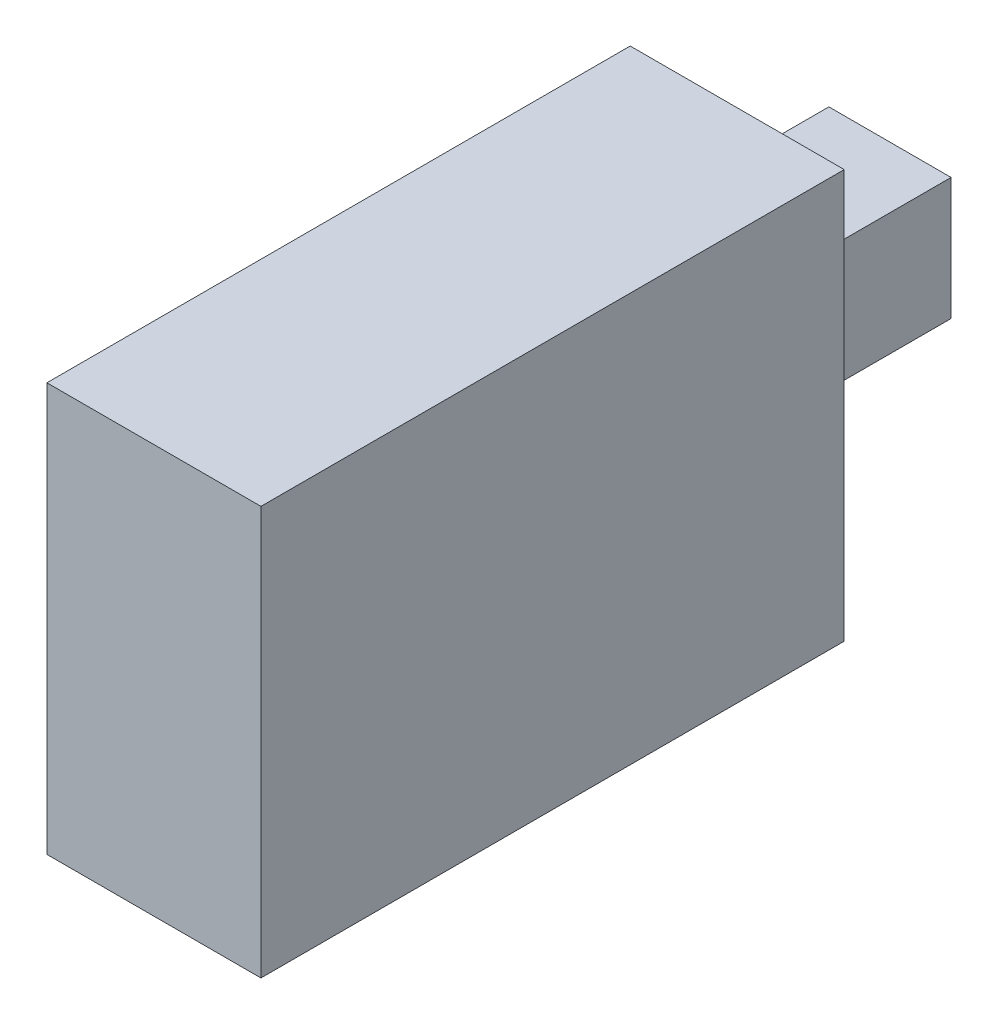
ISO-10303-21;
HEADER;
FILE_DESCRIPTION(('STEP AP214'),'2;1');
FILE_NAME('part.step','',(''),(''),'','','');
FILE_SCHEMA(('AUTOMOTIVE_DESIGN { 1 0 10303 214 1 1 1 1 }'));
ENDSEC;
DATA;
#1=APPLICATION_CONTEXT('core data for automotive mechanical design processes');
#2=APPLICATION_PROTOCOL_DEFINITION('international standard','automotive_design',2000,#1);
#3=PRODUCT_CONTEXT('',#1,'mechanical');
#4=PRODUCT('Part','Part','',(#3));
#5=PRODUCT_RELATED_PRODUCT_CATEGORY('part','',(#4));
#6=PRODUCT_DEFINITION_FORMATION('','',#4);
#7=PRODUCT_DEFINITION_CONTEXT('part definition',#1,'design');
#8=PRODUCT_DEFINITION('design','',#6,#7);
#9=PRODUCT_DEFINITION_SHAPE('','',#8);
#10=(LENGTH_UNIT() NAMED_UNIT(*) SI_UNIT(.MILLI.,.METRE.));
#11=(NAMED_UNIT(*) PLANE_ANGLE_UNIT() SI_UNIT($,.RADIAN.));
#12=(NAMED_UNIT(*) SI_UNIT($,.STERADIAN.) SOLID_ANGLE_UNIT());
#13=UNCERTAINTY_MEASURE_WITH_UNIT(LENGTH_MEASURE(1.E-05),#10,'distance_accuracy_value','');
#14=(GEOMETRIC_REPRESENTATION_CONTEXT(3) GLOBAL_UNCERTAINTY_ASSIGNED_CONTEXT((#13)) GLOBAL_UNIT_ASSIGNED_CONTEXT((#10,
#11,#12)) REPRESENTATION_CONTEXT('',''));
#15=CARTESIAN_POINT('',(0.,0.,0.));
#16=DIRECTION('',(0.,0.,1.));
#17=DIRECTION('',(1.,0.,0.));
#18=AXIS2_PLACEMENT_3D('',#15,#16,#17);
#19=CARTESIAN_POINT('',(-29.3274,0.,-45.77));
#20=DIRECTION('',(0.,0.,-1.));
#21=DIRECTION('',(-1.,0.,0.));
#22=AXIS2_PLACEMENT_3D('',#19,#20,#21);
#23=PLANE('',#22);
#24=DIRECTION('',(1.,0.,0.));
#25=VECTOR('',#24,1.);
#26=CARTESIAN_POINT('',(-24.1,5.6,-45.77));
#27=LINE('',#26,#25);
#28=CARTESIAN_POINT('',(-27.9,5.6,-45.77));
#29=VERTEX_POINT('',#28);
#30=CARTESIAN_POINT('',(-24.1,5.6,-45.77));
#31=VERTEX_POINT('',#30);
#32=EDGE_CURVE('E20',#29,#31,#27,.T.);
#33=ORIENTED_EDGE('',*,*,#32,.F.);
#34=DIRECTION('',(0.,1.,0.));
#35=VECTOR('',#34,1.);
#36=CARTESIAN_POINT('',(-27.9,5.6,-45.77));
#37=LINE('',#36,#35);
#38=CARTESIAN_POINT('',(-27.9,9.4,-45.77));
#39=VERTEX_POINT('',#38);
#40=EDGE_CURVE('E107',#39,#29,#37,.F.);
#41=ORIENTED_EDGE('',*,*,#40,.F.);
#42=DIRECTION('',(1.,0.,0.));
#43=VECTOR('',#42,1.);
#44=CARTESIAN_POINT('',(-27.9,9.4,-45.77));
#45=LINE('',#44,#43);
#46=CARTESIAN_POINT('',(-24.1,9.4,-45.77));
#47=VERTEX_POINT('',#46);
#48=EDGE_CURVE('E92',#47,#39,#45,.F.);
#49=ORIENTED_EDGE('',*,*,#48,.F.);
#50=DIRECTION('',(0.,1.,0.));
#51=VECTOR('',#50,1.);
#52=CARTESIAN_POINT('',(-24.1,9.4,-45.77));
#53=LINE('',#52,#51);
#54=EDGE_CURVE('E79',#31,#47,#53,.T.);
#55=ORIENTED_EDGE('',*,*,#54,.F.);
#56=EDGE_LOOP('',(#33,#41,#49,#55));
#57=FACE_BOUND('',#56,.T.);
#58=ADVANCED_FACE('F17',(#57),#23,.T.);
#59=CARTESIAN_POINT('',(-24.1,5.6,-41.02));
#60=DIRECTION('',(0.,-1.,0.));
#61=DIRECTION('',(0.,0.,-1.));
#62=AXIS2_PLACEMENT_3D('',#59,#60,#61);
#63=PLANE('',#62);
#64=DIRECTION('',(0.,0.,1.));
#65=VECTOR('',#64,1.);
#66=CARTESIAN_POINT('',(-27.9,5.6,-41.02));
#67=LINE('',#66,#65);
#68=CARTESIAN_POINT('',(-27.9,5.6,-41.02));
#69=VERTEX_POINT('',#68);
#70=EDGE_CURVE('E88',#29,#69,#67,.T.);
#71=ORIENTED_EDGE('',*,*,#70,.F.);
#72=ORIENTED_EDGE('',*,*,#32,.T.);
#73=DIRECTION('',(0.,0.,-1.));
#74=VECTOR('',#73,1.);
#75=CARTESIAN_POINT('',(-24.1,5.6,-41.02));
#76=LINE('',#75,#74);
#77=CARTESIAN_POINT('',(-24.1,5.6,-41.02));
#78=VERTEX_POINT('',#77);
#79=EDGE_CURVE('E85',#78,#31,#76,.T.);
#80=ORIENTED_EDGE('',*,*,#79,.F.);
#81=DIRECTION('',(-1.,0.,0.));
#82=VECTOR('',#81,1.);
#83=CARTESIAN_POINT('',(-22.6726,5.6,-41.02));
#84=LINE('',#83,#82);
#85=EDGE_CURVE('E109',#69,#78,#84,.F.);
#86=ORIENTED_EDGE('',*,*,#85,.F.);
#87=EDGE_LOOP('',(#71,#72,#80,#86));
#88=FACE_BOUND('',#87,.T.);
#89=ADVANCED_FACE('F84',(#88),#63,.T.);
#90=CARTESIAN_POINT('',(-24.1,9.4,-41.02));
#91=DIRECTION('',(1.,0.,0.));
#92=DIRECTION('',(0.,0.,-1.));
#93=AXIS2_PLACEMENT_3D('',#90,#91,#92);
#94=PLANE('',#93);
#95=ORIENTED_EDGE('',*,*,#79,.T.);
#96=ORIENTED_EDGE('',*,*,#54,.T.);
#97=DIRECTION('',(0.,0.,1.));
#98=VECTOR('',#97,1.);
#99=CARTESIAN_POINT('',(-24.1,9.4,-41.02));
#100=LINE('',#99,#98);
#101=CARTESIAN_POINT('',(-24.1,9.4,-41.02));
#102=VERTEX_POINT('',#101);
#103=EDGE_CURVE('E94',#102,#47,#100,.F.);
#104=ORIENTED_EDGE('',*,*,#103,.F.);
#105=DIRECTION('',(0.,1.,0.));
#106=VECTOR('',#105,1.);
#107=CARTESIAN_POINT('',(-24.1,0.,-41.02));
#108=LINE('',#107,#106);
#109=EDGE_CURVE('E98',#78,#102,#108,.T.);
#110=ORIENTED_EDGE('',*,*,#109,.F.);
#111=EDGE_LOOP('',(#95,#96,#104,#110));
#112=FACE_BOUND('',#111,.T.);
#113=ADVANCED_FACE('F96',(#112),#94,.T.);
#114=CARTESIAN_POINT('',(-27.9,9.4,-41.02));
#115=DIRECTION('',(0.,1.,0.));
#116=DIRECTION('',(0.,0.,1.));
#117=AXIS2_PLACEMENT_3D('',#114,#115,#116);
#118=PLANE('',#117);
#119=ORIENTED_EDGE('',*,*,#103,.T.);
#120=ORIENTED_EDGE('',*,*,#48,.T.);
#121=DIRECTION('',(0.,0.,1.));
#122=VECTOR('',#121,1.);
#123=CARTESIAN_POINT('',(-27.9,9.4,-41.02));
#124=LINE('',#123,#122);
#125=CARTESIAN_POINT('',(-27.9,9.4,-41.02));
#126=VERTEX_POINT('',#125);
#127=EDGE_CURVE('E104',#126,#39,#124,.F.);
#128=ORIENTED_EDGE('',*,*,#127,.F.);
#129=DIRECTION('',(-1.,0.,0.));
#130=VECTOR('',#129,1.);
#131=CARTESIAN_POINT('',(-22.6726,9.4,-41.02));
#132=LINE('',#131,#130);
#133=EDGE_CURVE('E112',#102,#126,#132,.T.);
#134=ORIENTED_EDGE('',*,*,#133,.F.);
#135=EDGE_LOOP('',(#119,#120,#128,#134));
#136=FACE_BOUND('',#135,.T.);
#137=ADVANCED_FACE('F166',(#136),#118,.T.);
#138=CARTESIAN_POINT('',(-27.9,5.6,-41.02));
#139=DIRECTION('',(-1.,0.,0.));
#140=DIRECTION('',(0.,0.,1.));
#141=AXIS2_PLACEMENT_3D('',#138,#139,#140);
#142=PLANE('',#141);
#143=ORIENTED_EDGE('',*,*,#127,.T.);
#144=ORIENTED_EDGE('',*,*,#40,.T.);
#145=ORIENTED_EDGE('',*,*,#70,.T.);
#146=DIRECTION('',(0.,1.,0.));
#147=VECTOR('',#146,1.);
#148=CARTESIAN_POINT('',(-27.9,0.,-41.02));
#149=LINE('',#148,#147);
#150=EDGE_CURVE('E115',#126,#69,#149,.F.);
#151=ORIENTED_EDGE('',*,*,#150,.F.);
#152=EDGE_LOOP('',(#143,#144,#145,#151));
#153=FACE_BOUND('',#152,.T.);
#154=ADVANCED_FACE('F168',(#153),#142,.T.);
#155=CARTESIAN_POINT('',(-22.6726,0.,-22.884));
#156=DIRECTION('',(1.,0.,0.));
#157=DIRECTION('',(0.,0.,-1.));
#158=AXIS2_PLACEMENT_3D('',#155,#156,#157);
#159=PLANE('',#158);
#160=DIRECTION('',(0.,1.,0.));
#161=VECTOR('',#160,1.);
#162=CARTESIAN_POINT('',(-22.6726,0.,-41.02));
#163=LINE('',#162,#161);
#164=CARTESIAN_POINT('',(-22.6726,12.7,-41.02));
#165=VERTEX_POINT('',#164);
#166=CARTESIAN_POINT('',(-22.6726,0.,-41.02));
#167=VERTEX_POINT('',#166);
#168=EDGE_CURVE('E118',#165,#167,#163,.F.);
#169=ORIENTED_EDGE('',*,*,#168,.F.);
#170=DIRECTION('',(0.,0.,1.));
#171=VECTOR('',#170,1.);
#172=CARTESIAN_POINT('',(-22.6726,12.7,0.));
#173=LINE('',#172,#171);
#174=CARTESIAN_POINT('',(-22.6726,12.7,-22.884));
#175=VERTEX_POINT('',#174);
#176=EDGE_CURVE('E131',#175,#165,#173,.F.);
#177=ORIENTED_EDGE('',*,*,#176,.F.);
#178=DIRECTION('',(0.,1.,0.));
#179=VECTOR('',#178,1.);
#180=CARTESIAN_POINT('',(-22.6726,0.,-22.884));
#181=LINE('',#180,#179);
#182=CARTESIAN_POINT('',(-22.6726,0.,-22.884));
#183=VERTEX_POINT('',#182);
#184=EDGE_CURVE('E128',#183,#175,#181,.T.);
#185=ORIENTED_EDGE('',*,*,#184,.F.);
#186=DIRECTION('',(0.,0.,1.));
#187=VECTOR('',#186,1.);
#188=CARTESIAN_POINT('',(-22.6726,0.,-45.72));
#189=LINE('',#188,#187);
#190=EDGE_CURVE('E121',#183,#167,#189,.F.);
#191=ORIENTED_EDGE('',*,*,#190,.T.);
#192=EDGE_LOOP('',(#169,#177,#185,#191));
#193=FACE_BOUND('',#192,.T.);
#194=ADVANCED_FACE('F154',(#193),#159,.T.);
#195=CARTESIAN_POINT('',(-22.6726,0.,-41.02));
#196=DIRECTION('',(0.,0.,-1.));
#197=DIRECTION('',(-1.,0.,0.));
#198=AXIS2_PLACEMENT_3D('',#195,#196,#197);
#199=PLANE('',#198);
#200=DIRECTION('',(0.,1.,0.));
#201=VECTOR('',#200,1.);
#202=CARTESIAN_POINT('',(-29.3274,0.,-41.02));
#203=LINE('',#202,#201);
#204=CARTESIAN_POINT('',(-29.3274,12.7,-41.02));
#205=VERTEX_POINT('',#204);
#206=CARTESIAN_POINT('',(-29.3274,0.,-41.02));
#207=VERTEX_POINT('',#206);
#208=EDGE_CURVE('E137',#205,#207,#203,.F.);
#209=ORIENTED_EDGE('',*,*,#208,.F.);
#210=DIRECTION('',(1.,0.,0.));
#211=VECTOR('',#210,1.);
#212=CARTESIAN_POINT('',(0.,12.7,-41.02));
#213=LINE('',#212,#211);
#214=EDGE_CURVE('E134',#165,#205,#213,.F.);
#215=ORIENTED_EDGE('',*,*,#214,.F.);
#216=ORIENTED_EDGE('',*,*,#168,.T.);
#217=DIRECTION('',(1.,0.,0.));
#218=VECTOR('',#217,1.);
#219=CARTESIAN_POINT('',(-30.92241196527,0.,-41.02));
#220=LINE('',#219,#218);
#221=EDGE_CURVE('E123',#167,#207,#220,.F.);
#222=ORIENTED_EDGE('',*,*,#221,.T.);
#223=EDGE_LOOP('',(#209,#215,#216,#222));
#224=FACE_BOUND('',#223,.T.);
#225=ORIENTED_EDGE('',*,*,#133,.T.);
#226=ORIENTED_EDGE('',*,*,#150,.T.);
#227=ORIENTED_EDGE('',*,*,#85,.T.);
#228=ORIENTED_EDGE('',*,*,#109,.T.);
#229=EDGE_LOOP('',(#225,#226,#227,#228));
#230=FACE_BOUND('',#229,.T.);
#231=ADVANCED_FACE('F159',(#224,#230),#199,.T.);
#232=CARTESIAN_POINT('',(-30.92241196527,0.,-45.72));
#233=DIRECTION('',(0.,1.,0.));
#234=DIRECTION('',(0.,0.,1.));
#235=AXIS2_PLACEMENT_3D('',#232,#233,#234);
#236=PLANE('',#235);
#237=ORIENTED_EDGE('',*,*,#221,.F.);
#238=ORIENTED_EDGE('',*,*,#190,.F.);
#239=DIRECTION('',(1.,0.,0.));
#240=VECTOR('',#239,1.);
#241=CARTESIAN_POINT('',(-29.3274,0.,-22.884));
#242=LINE('',#241,#240);
#243=CARTESIAN_POINT('',(-29.3274,0.,-22.884));
#244=VERTEX_POINT('',#243);
#245=EDGE_CURVE('E125',#244,#183,#242,.T.);
#246=ORIENTED_EDGE('',*,*,#245,.F.);
#247=DIRECTION('',(0.,0.,1.));
#248=VECTOR('',#247,1.);
#249=CARTESIAN_POINT('',(-29.3274,0.,-41.02));
#250=LINE('',#249,#248);
#251=EDGE_CURVE('E140',#207,#244,#250,.T.);
#252=ORIENTED_EDGE('',*,*,#251,.F.);
#253=EDGE_LOOP('',(#237,#238,#246,#252));
#254=FACE_BOUND('',#253,.T.);
#255=ADVANCED_FACE('F152',(#254),#236,.F.);
#256=CARTESIAN_POINT('',(-29.3274,0.,-22.884));
#257=DIRECTION('',(0.,0.,1.));
#258=DIRECTION('',(1.,0.,0.));
#259=AXIS2_PLACEMENT_3D('',#256,#257,#258);
#260=PLANE('',#259);
#261=ORIENTED_EDGE('',*,*,#184,.T.);
#262=DIRECTION('',(1.,0.,0.));
#263=VECTOR('',#262,1.);
#264=CARTESIAN_POINT('',(0.,12.7,-22.884));
#265=LINE('',#264,#263);
#266=CARTESIAN_POINT('',(-29.3274,12.7,-22.884));
#267=VERTEX_POINT('',#266);
#268=EDGE_CURVE('E35',#267,#175,#265,.T.);
#269=ORIENTED_EDGE('',*,*,#268,.F.);
#270=DIRECTION('',(0.,1.,0.));
#271=VECTOR('',#270,1.);
#272=CARTESIAN_POINT('',(-29.3274,0.,-22.884));
#273=LINE('',#272,#271);
#274=EDGE_CURVE('E26',#244,#267,#273,.T.);
#275=ORIENTED_EDGE('',*,*,#274,.F.);
#276=ORIENTED_EDGE('',*,*,#245,.T.);
#277=EDGE_LOOP('',(#261,#269,#275,#276));
#278=FACE_BOUND('',#277,.T.);
#279=ADVANCED_FACE('F147',(#278),#260,.T.);
#280=CARTESIAN_POINT('',(0.,12.7,0.));
#281=DIRECTION('',(0.,1.,0.));
#282=DIRECTION('',(0.,0.,1.));
#283=AXIS2_PLACEMENT_3D('',#280,#281,#282);
#284=PLANE('',#283);
#285=ORIENTED_EDGE('',*,*,#214,.T.);
#286=DIRECTION('',(0.,0.,1.));
#287=VECTOR('',#286,1.);
#288=CARTESIAN_POINT('',(-29.3274,12.7,-41.02));
#289=LINE('',#288,#287);
#290=EDGE_CURVE('E11',#267,#205,#289,.F.);
#291=ORIENTED_EDGE('',*,*,#290,.F.);
#292=ORIENTED_EDGE('',*,*,#268,.T.);
#293=ORIENTED_EDGE('',*,*,#176,.T.);
#294=EDGE_LOOP('',(#285,#291,#292,#293));
#295=FACE_BOUND('',#294,.T.);
#296=ADVANCED_FACE('F157',(#295),#284,.T.);
#297=CARTESIAN_POINT('',(-29.3274,0.,-41.02));
#298=DIRECTION('',(-1.,0.,0.));
#299=DIRECTION('',(0.,0.,1.));
#300=AXIS2_PLACEMENT_3D('',#297,#298,#299);
#301=PLANE('',#300);
#302=ORIENTED_EDGE('',*,*,#274,.T.);
#303=ORIENTED_EDGE('',*,*,#290,.T.);
#304=ORIENTED_EDGE('',*,*,#208,.T.);
#305=ORIENTED_EDGE('',*,*,#251,.T.);
#306=EDGE_LOOP('',(#302,#303,#304,#305));
#307=FACE_BOUND('',#306,.T.);
#308=ADVANCED_FACE('F145',(#307),#301,.T.);
#309=CLOSED_SHELL('',(#58,#89,#113,#137,#154,#194,#231,#255,#279,#296,#308));
#310=MANIFOLD_SOLID_BREP('B1',#309);
#311=ADVANCED_BREP_SHAPE_REPRESENTATION('',(#18,#310),#14);
#312=SHAPE_DEFINITION_REPRESENTATION(#9,#311);
ENDSEC;
END-ISO-10303-21;
